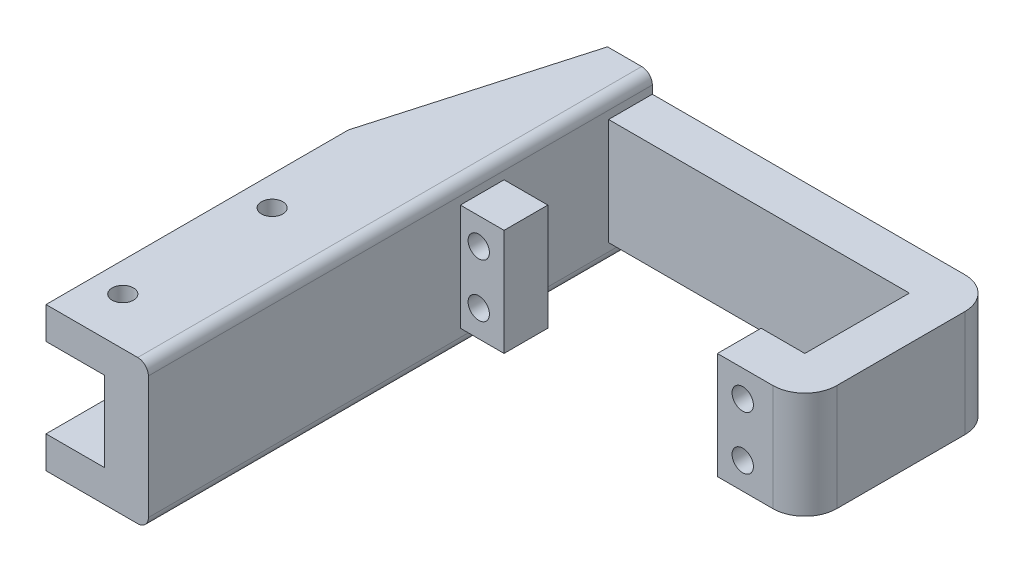
ISO-10303-21;
HEADER;
FILE_DESCRIPTION(('STEP AP214'),'2;1');
FILE_NAME('part.step','',(''),(''),'','','');
FILE_SCHEMA(('AUTOMOTIVE_DESIGN { 1 0 10303 214 1 1 1 1 }'));
ENDSEC;
DATA;
#1=APPLICATION_CONTEXT('core data for automotive mechanical design processes');
#2=APPLICATION_PROTOCOL_DEFINITION('international standard','automotive_design',2000,#1);
#3=PRODUCT_CONTEXT('',#1,'mechanical');
#4=PRODUCT('Part','Part','',(#3));
#5=PRODUCT_RELATED_PRODUCT_CATEGORY('part','',(#4));
#6=PRODUCT_DEFINITION_FORMATION('','',#4);
#7=PRODUCT_DEFINITION_CONTEXT('part definition',#1,'design');
#8=PRODUCT_DEFINITION('design','',#6,#7);
#9=PRODUCT_DEFINITION_SHAPE('','',#8);
#10=(LENGTH_UNIT() NAMED_UNIT(*) SI_UNIT(.MILLI.,.METRE.));
#11=(NAMED_UNIT(*) PLANE_ANGLE_UNIT() SI_UNIT($,.RADIAN.));
#12=(NAMED_UNIT(*) SI_UNIT($,.STERADIAN.) SOLID_ANGLE_UNIT());
#13=UNCERTAINTY_MEASURE_WITH_UNIT(LENGTH_MEASURE(1.E-05),#10,'distance_accuracy_value','');
#14=(GEOMETRIC_REPRESENTATION_CONTEXT(3) GLOBAL_UNCERTAINTY_ASSIGNED_CONTEXT((#13)) GLOBAL_UNIT_ASSIGNED_CONTEXT((#10,
#11,#12)) REPRESENTATION_CONTEXT('',''));
#15=CARTESIAN_POINT('',(0.,0.,0.));
#16=DIRECTION('',(0.,0.,1.));
#17=DIRECTION('',(1.,0.,0.));
#18=AXIS2_PLACEMENT_3D('',#15,#16,#17);
#19=CARTESIAN_POINT('',(-8.2,0.,0.));
#20=DIRECTION('',(1.,0.,0.));
#21=DIRECTION('',(0.,0.,-1.));
#22=AXIS2_PLACEMENT_3D('',#19,#20,#21);
#23=PLANE('',#22);
#24=DIRECTION('',(0.,1.,0.));
#25=VECTOR('',#24,1.);
#26=CARTESIAN_POINT('',(-8.2,23.5,47.8));
#27=LINE('',#26,#25);
#28=CARTESIAN_POINT('',(-8.2,2.5,47.8));
#29=VERTEX_POINT('',#28);
#30=CARTESIAN_POINT('',(-8.2,17.5,47.8));
#31=VERTEX_POINT('',#30);
#32=EDGE_CURVE('E221',#29,#31,#27,.T.);
#33=ORIENTED_EDGE('',*,*,#32,.F.);
#34=DIRECTION('',(0.,0.,1.));
#35=VECTOR('',#34,1.);
#36=CARTESIAN_POINT('',(-8.2,2.5,0.));
#37=LINE('',#36,#35);
#38=CARTESIAN_POINT('',(-8.2,2.5,94.5));
#39=VERTEX_POINT('',#38);
#40=EDGE_CURVE('E279',#29,#39,#37,.T.);
#41=ORIENTED_EDGE('',*,*,#40,.T.);
#42=DIRECTION('',(0.,-1.,0.));
#43=VECTOR('',#42,1.);
#44=CARTESIAN_POINT('',(-8.2,17.5,94.5));
#45=LINE('',#44,#43);
#46=CARTESIAN_POINT('',(-8.2,17.5,94.5));
#47=VERTEX_POINT('',#46);
#48=EDGE_CURVE('E257',#47,#39,#45,.T.);
#49=ORIENTED_EDGE('',*,*,#48,.F.);
#50=DIRECTION('',(0.,0.,1.));
#51=VECTOR('',#50,1.);
#52=CARTESIAN_POINT('',(-8.2,17.5,0.));
#53=LINE('',#52,#51);
#54=EDGE_CURVE('E209',#31,#47,#53,.T.);
#55=ORIENTED_EDGE('',*,*,#54,.F.);
#56=EDGE_LOOP('',(#33,#41,#49,#55));
#57=FACE_BOUND('',#56,.T.);
#58=ADVANCED_FACE('F32',(#57),#23,.F.);
#59=CARTESIAN_POINT('',(64.6,20.,8.2));
#60=DIRECTION('',(0.,-1.,0.));
#61=DIRECTION('',(1.,0.,0.));
#62=AXIS2_PLACEMENT_3D('',#59,#60,#61);
#63=PLANE('',#62);
#64=DIRECTION('',(0.,0.,-1.));
#65=VECTOR('',#64,1.);
#66=CARTESIAN_POINT('',(0.,20.,36.));
#67=LINE('',#66,#65);
#68=CARTESIAN_POINT('',(0.,20.,36.));
#69=VERTEX_POINT('',#68);
#70=CARTESIAN_POINT('',(0.,20.,27.8));
#71=VERTEX_POINT('',#70);
#72=EDGE_CURVE('E285',#69,#71,#67,.T.);
#73=ORIENTED_EDGE('',*,*,#72,.F.);
#74=DIRECTION('',(-1.,0.,0.));
#75=VECTOR('',#74,1.);
#76=CARTESIAN_POINT('',(8.2,20.,36.));
#77=LINE('',#76,#75);
#78=CARTESIAN_POINT('',(8.2,20.,36.));
#79=VERTEX_POINT('',#78);
#80=EDGE_CURVE('E370',#79,#69,#77,.T.);
#81=ORIENTED_EDGE('',*,*,#80,.F.);
#82=DIRECTION('',(0.,0.,-1.));
#83=VECTOR('',#82,1.);
#84=CARTESIAN_POINT('',(8.2,20.,36.));
#85=LINE('',#84,#83);
#86=CARTESIAN_POINT('',(8.2,20.,27.8));
#87=VERTEX_POINT('',#86);
#88=EDGE_CURVE('E377',#79,#87,#85,.T.);
#89=ORIENTED_EDGE('',*,*,#88,.T.);
#90=DIRECTION('',(-1.,0.,0.));
#91=VECTOR('',#90,1.);
#92=CARTESIAN_POINT('',(48.2,20.,27.8));
#93=LINE('',#92,#91);
#94=EDGE_CURVE('E326',#87,#71,#93,.T.);
#95=ORIENTED_EDGE('',*,*,#94,.T.);
#96=EDGE_LOOP('',(#73,#81,#89,#95));
#97=FACE_BOUND('',#96,.T.);
#98=ADVANCED_FACE('F464',(#97),#63,.F.);
#99=CARTESIAN_POINT('',(0.,20.,8.2));
#100=VERTEX_POINT('',#99);
#101=CARTESIAN_POINT('',(0.,20.,0.));
#102=VERTEX_POINT('',#101);
#103=EDGE_CURVE('E291',#100,#102,#67,.T.);
#104=ORIENTED_EDGE('',*,*,#103,.F.);
#105=DIRECTION('',(-1.,0.,0.));
#106=VECTOR('',#105,1.);
#107=CARTESIAN_POINT('',(64.6,20.,8.2));
#108=LINE('',#107,#106);
#109=CARTESIAN_POINT('',(56.4,20.,8.2));
#110=VERTEX_POINT('',#109);
#111=EDGE_CURVE('E386',#110,#100,#108,.T.);
#112=ORIENTED_EDGE('',*,*,#111,.F.);
#113=DIRECTION('',(0.,0.,-1.));
#114=VECTOR('',#113,1.);
#115=CARTESIAN_POINT('',(56.4,20.,36.));
#116=LINE('',#115,#114);
#117=CARTESIAN_POINT('',(56.4,20.,27.8));
#118=VERTEX_POINT('',#117);
#119=EDGE_CURVE('E368',#118,#110,#116,.T.);
#120=ORIENTED_EDGE('',*,*,#119,.F.);
#121=DIRECTION('',(1.,0.,0.));
#122=VECTOR('',#121,1.);
#123=CARTESIAN_POINT('',(48.2,20.,27.8));
#124=LINE('',#123,#122);
#125=CARTESIAN_POINT('',(48.2,20.,27.8));
#126=VERTEX_POINT('',#125);
#127=EDGE_CURVE('E355',#126,#118,#124,.T.);
#128=ORIENTED_EDGE('',*,*,#127,.F.);
#129=DIRECTION('',(0.,0.,-1.));
#130=VECTOR('',#129,1.);
#131=CARTESIAN_POINT('',(48.2,20.,36.));
#132=LINE('',#131,#130);
#133=CARTESIAN_POINT('',(48.2,20.,36.));
#134=VERTEX_POINT('',#133);
#135=EDGE_CURVE('E344',#134,#126,#132,.T.);
#136=ORIENTED_EDGE('',*,*,#135,.F.);
#137=DIRECTION('',(-1.,0.,0.));
#138=VECTOR('',#137,1.);
#139=CARTESIAN_POINT('',(56.4,20.,36.));
#140=LINE('',#139,#138);
#141=CARTESIAN_POINT('',(58.6,20.,36.));
#142=VERTEX_POINT('',#141);
#143=EDGE_CURVE('E358',#142,#134,#140,.T.);
#144=ORIENTED_EDGE('',*,*,#143,.F.);
#145=CARTESIAN_POINT('',(58.6,20.,30.));
#146=DIRECTION('',(0.,-1.,0.));
#147=DIRECTION('',(1.,0.,0.));
#148=AXIS2_PLACEMENT_3D('',#145,#146,#147);
#149=CIRCLE('',#148,6.);
#150=CARTESIAN_POINT('',(64.6,20.,30.));
#151=VERTEX_POINT('',#150);
#152=EDGE_CURVE('E404',#142,#151,#149,.F.);
#153=ORIENTED_EDGE('',*,*,#152,.T.);
#154=DIRECTION('',(0.,0.,-1.));
#155=VECTOR('',#154,1.);
#156=CARTESIAN_POINT('',(64.6,20.,8.2));
#157=LINE('',#156,#155);
#158=CARTESIAN_POINT('',(64.6,20.,6.));
#159=VERTEX_POINT('',#158);
#160=EDGE_CURVE('E390',#151,#159,#157,.T.);
#161=ORIENTED_EDGE('',*,*,#160,.T.);
#162=CARTESIAN_POINT('',(58.6,20.,6.));
#163=DIRECTION('',(0.,-1.,0.));
#164=DIRECTION('',(1.,0.,0.));
#165=AXIS2_PLACEMENT_3D('',#162,#163,#164);
#166=CIRCLE('',#165,6.);
#167=CARTESIAN_POINT('',(58.6,20.,0.));
#168=VERTEX_POINT('',#167);
#169=EDGE_CURVE('E406',#159,#168,#166,.F.);
#170=ORIENTED_EDGE('',*,*,#169,.T.);
#171=DIRECTION('',(-1.,0.,0.));
#172=VECTOR('',#171,1.);
#173=CARTESIAN_POINT('',(64.6,20.,0.));
#174=LINE('',#173,#172);
#175=EDGE_CURVE('E387',#168,#102,#174,.T.);
#176=ORIENTED_EDGE('',*,*,#175,.T.);
#177=EDGE_LOOP('',(#104,#112,#120,#128,#136,#144,#153,#161,#170,#176));
#178=FACE_BOUND('',#177,.T.);
#179=ADVANCED_FACE('F469',(#178),#63,.F.);
#180=CARTESIAN_POINT('',(0.,0.,8.2));
#181=DIRECTION('',(0.,1.,0.));
#182=DIRECTION('',(0.,0.,1.));
#183=AXIS2_PLACEMENT_3D('',#180,#181,#182);
#184=PLANE('',#183);
#185=DIRECTION('',(0.,0.,1.));
#186=VECTOR('',#185,1.);
#187=CARTESIAN_POINT('',(0.,0.,0.));
#188=LINE('',#187,#186);
#189=CARTESIAN_POINT('',(0.,0.,0.));
#190=VERTEX_POINT('',#189);
#191=CARTESIAN_POINT('',(0.,0.,8.2));
#192=VERTEX_POINT('',#191);
#193=EDGE_CURVE('E293',#190,#192,#188,.T.);
#194=ORIENTED_EDGE('',*,*,#193,.F.);
#195=DIRECTION('',(1.,0.,0.));
#196=VECTOR('',#195,1.);
#197=CARTESIAN_POINT('',(0.,0.,0.));
#198=LINE('',#197,#196);
#199=CARTESIAN_POINT('',(58.6,0.,0.));
#200=VERTEX_POINT('',#199);
#201=EDGE_CURVE('E383',#190,#200,#198,.T.);
#202=ORIENTED_EDGE('',*,*,#201,.T.);
#203=CARTESIAN_POINT('',(58.6,0.,6.));
#204=DIRECTION('',(0.,1.,0.));
#205=DIRECTION('',(0.,0.,1.));
#206=AXIS2_PLACEMENT_3D('',#203,#204,#205);
#207=CIRCLE('',#206,6.);
#208=CARTESIAN_POINT('',(64.6,0.,6.));
#209=VERTEX_POINT('',#208);
#210=EDGE_CURVE('E413',#200,#209,#207,.F.);
#211=ORIENTED_EDGE('',*,*,#210,.T.);
#212=DIRECTION('',(0.,0.,-1.));
#213=VECTOR('',#212,1.);
#214=CARTESIAN_POINT('',(64.6,0.,8.2));
#215=LINE('',#214,#213);
#216=CARTESIAN_POINT('',(64.6,0.,30.));
#217=VERTEX_POINT('',#216);
#218=EDGE_CURVE('E396',#217,#209,#215,.T.);
#219=ORIENTED_EDGE('',*,*,#218,.F.);
#220=CARTESIAN_POINT('',(58.6,0.,30.));
#221=DIRECTION('',(0.,1.,0.));
#222=DIRECTION('',(0.,0.,1.));
#223=AXIS2_PLACEMENT_3D('',#220,#221,#222);
#224=CIRCLE('',#223,6.);
#225=CARTESIAN_POINT('',(58.6,0.,36.));
#226=VERTEX_POINT('',#225);
#227=EDGE_CURVE('E411',#217,#226,#224,.F.);
#228=ORIENTED_EDGE('',*,*,#227,.T.);
#229=DIRECTION('',(1.,0.,0.));
#230=VECTOR('',#229,1.);
#231=CARTESIAN_POINT('',(64.6,0.,36.));
#232=LINE('',#231,#230);
#233=CARTESIAN_POINT('',(48.2,0.,36.));
#234=VERTEX_POINT('',#233);
#235=EDGE_CURVE('E360',#234,#226,#232,.T.);
#236=ORIENTED_EDGE('',*,*,#235,.F.);
#237=DIRECTION('',(0.,0.,1.));
#238=VECTOR('',#237,1.);
#239=CARTESIAN_POINT('',(48.2,0.,27.8));
#240=LINE('',#239,#238);
#241=CARTESIAN_POINT('',(48.2,0.,27.8));
#242=VERTEX_POINT('',#241);
#243=EDGE_CURVE('E348',#242,#234,#240,.T.);
#244=ORIENTED_EDGE('',*,*,#243,.F.);
#245=DIRECTION('',(1.,0.,0.));
#246=VECTOR('',#245,1.);
#247=CARTESIAN_POINT('',(48.2,0.,27.8));
#248=LINE('',#247,#246);
#249=CARTESIAN_POINT('',(56.4,0.,27.8));
#250=VERTEX_POINT('',#249);
#251=EDGE_CURVE('E351',#242,#250,#248,.T.);
#252=ORIENTED_EDGE('',*,*,#251,.T.);
#253=DIRECTION('',(0.,0.,-1.));
#254=VECTOR('',#253,1.);
#255=CARTESIAN_POINT('',(56.4,0.,36.));
#256=LINE('',#255,#254);
#257=CARTESIAN_POINT('',(56.4,0.,8.2));
#258=VERTEX_POINT('',#257);
#259=EDGE_CURVE('E363',#250,#258,#256,.T.);
#260=ORIENTED_EDGE('',*,*,#259,.T.);
#261=DIRECTION('',(1.,0.,0.));
#262=VECTOR('',#261,1.);
#263=CARTESIAN_POINT('',(0.,0.,8.2));
#264=LINE('',#263,#262);
#265=EDGE_CURVE('E384',#192,#258,#264,.T.);
#266=ORIENTED_EDGE('',*,*,#265,.F.);
#267=EDGE_LOOP('',(#194,#202,#211,#219,#228,#236,#244,#252,#260,#266));
#268=FACE_BOUND('',#267,.T.);
#269=ADVANCED_FACE('F511',(#268),#184,.F.);
#270=CARTESIAN_POINT('',(0.,0.,27.8));
#271=VERTEX_POINT('',#270);
#272=CARTESIAN_POINT('',(0.,0.,36.));
#273=VERTEX_POINT('',#272);
#274=EDGE_CURVE('E299',#271,#273,#188,.T.);
#275=ORIENTED_EDGE('',*,*,#274,.F.);
#276=DIRECTION('',(-1.,0.,0.));
#277=VECTOR('',#276,1.);
#278=CARTESIAN_POINT('',(48.2,0.,27.8));
#279=LINE('',#278,#277);
#280=CARTESIAN_POINT('',(8.2,0.,27.8));
#281=VERTEX_POINT('',#280);
#282=EDGE_CURVE('E325',#281,#271,#279,.T.);
#283=ORIENTED_EDGE('',*,*,#282,.F.);
#284=DIRECTION('',(0.,0.,-1.));
#285=VECTOR('',#284,1.);
#286=CARTESIAN_POINT('',(8.2,0.,36.));
#287=LINE('',#286,#285);
#288=CARTESIAN_POINT('',(8.2,0.,36.));
#289=VERTEX_POINT('',#288);
#290=EDGE_CURVE('E380',#289,#281,#287,.T.);
#291=ORIENTED_EDGE('',*,*,#290,.F.);
#292=DIRECTION('',(1.,0.,0.));
#293=VECTOR('',#292,1.);
#294=CARTESIAN_POINT('',(0.,0.,36.));
#295=LINE('',#294,#293);
#296=EDGE_CURVE('E373',#273,#289,#295,.T.);
#297=ORIENTED_EDGE('',*,*,#296,.F.);
#298=EDGE_LOOP('',(#275,#283,#291,#297));
#299=FACE_BOUND('',#298,.T.);
#300=ADVANCED_FACE('F493',(#299),#184,.F.);
#301=CARTESIAN_POINT('',(56.4,0.,36.));
#302=DIRECTION('',(1.,0.,0.));
#303=DIRECTION('',(0.,0.,-1.));
#304=AXIS2_PLACEMENT_3D('',#301,#302,#303);
#305=PLANE('',#304);
#306=DIRECTION('',(0.,-1.,0.));
#307=VECTOR('',#306,1.);
#308=CARTESIAN_POINT('',(56.4,20.,27.8));
#309=LINE('',#308,#307);
#310=EDGE_CURVE('E340',#118,#250,#309,.T.);
#311=ORIENTED_EDGE('',*,*,#310,.F.);
#312=ORIENTED_EDGE('',*,*,#119,.T.);
#313=DIRECTION('',(0.,-1.,0.));
#314=VECTOR('',#313,1.);
#315=CARTESIAN_POINT('',(56.4,0.,8.2));
#316=LINE('',#315,#314);
#317=EDGE_CURVE('E357',#110,#258,#316,.T.);
#318=ORIENTED_EDGE('',*,*,#317,.T.);
#319=ORIENTED_EDGE('',*,*,#259,.F.);
#320=EDGE_LOOP('',(#311,#312,#318,#319));
#321=FACE_BOUND('',#320,.T.);
#322=ADVANCED_FACE('F489',(#321),#305,.F.);
#323=CARTESIAN_POINT('',(0.,0.,8.2));
#324=DIRECTION('',(0.,0.,1.));
#325=DIRECTION('',(1.,0.,0.));
#326=AXIS2_PLACEMENT_3D('',#323,#324,#325);
#327=PLANE('',#326);
#328=ORIENTED_EDGE('',*,*,#111,.T.);
#329=DIRECTION('',(0.,-1.,0.));
#330=VECTOR('',#329,1.);
#331=CARTESIAN_POINT('',(0.,20.,8.2));
#332=LINE('',#331,#330);
#333=EDGE_CURVE('E332',#100,#192,#332,.T.);
#334=ORIENTED_EDGE('',*,*,#333,.T.);
#335=ORIENTED_EDGE('',*,*,#265,.T.);
#336=ORIENTED_EDGE('',*,*,#317,.F.);
#337=EDGE_LOOP('',(#328,#334,#335,#336));
#338=FACE_BOUND('',#337,.T.);
#339=ADVANCED_FACE('F492',(#338),#327,.T.);
#340=CARTESIAN_POINT('',(64.6,0.,8.2));
#341=DIRECTION('',(-1.,0.,0.));
#342=DIRECTION('',(0.,0.,1.));
#343=AXIS2_PLACEMENT_3D('',#340,#341,#342);
#344=PLANE('',#343);
#345=ORIENTED_EDGE('',*,*,#218,.T.);
#346=DIRECTION('',(0.,1.,0.));
#347=VECTOR('',#346,1.);
#348=CARTESIAN_POINT('',(64.6,0.,6.));
#349=LINE('',#348,#347);
#350=EDGE_CURVE('E401',#209,#159,#349,.T.);
#351=ORIENTED_EDGE('',*,*,#350,.T.);
#352=ORIENTED_EDGE('',*,*,#160,.F.);
#353=DIRECTION('',(0.,1.,0.));
#354=VECTOR('',#353,1.);
#355=CARTESIAN_POINT('',(64.6,0.,30.));
#356=LINE('',#355,#354);
#357=EDGE_CURVE('E399',#151,#217,#356,.F.);
#358=ORIENTED_EDGE('',*,*,#357,.T.);
#359=EDGE_LOOP('',(#345,#351,#352,#358));
#360=FACE_BOUND('',#359,.T.);
#361=ADVANCED_FACE('F504',(#360),#344,.F.);
#362=CARTESIAN_POINT('',(0.,0.,0.));
#363=DIRECTION('',(0.,0.,1.));
#364=DIRECTION('',(1.,0.,0.));
#365=AXIS2_PLACEMENT_3D('',#362,#363,#364);
#366=PLANE('',#365);
#367=DIRECTION('',(1.,0.,0.));
#368=VECTOR('',#367,1.);
#369=CARTESIAN_POINT('',(-8.2,-3.5,0.));
#370=LINE('',#369,#368);
#371=CARTESIAN_POINT('',(-8.4,-3.5,0.));
#372=VERTEX_POINT('',#371);
#373=CARTESIAN_POINT('',(-2.,-3.5,0.));
#374=VERTEX_POINT('',#373);
#375=EDGE_CURVE('E294',#372,#374,#370,.T.);
#376=ORIENTED_EDGE('',*,*,#375,.F.);
#377=DIRECTION('',(0.,-1.,0.));
#378=VECTOR('',#377,1.);
#379=CARTESIAN_POINT('',(-8.4,0.,0.));
#380=LINE('',#379,#378);
#381=CARTESIAN_POINT('',(-8.4,23.5,0.));
#382=VERTEX_POINT('',#381);
#383=EDGE_CURVE('E41',#372,#382,#380,.F.);
#384=ORIENTED_EDGE('',*,*,#383,.T.);
#385=DIRECTION('',(-1.,0.,0.));
#386=VECTOR('',#385,1.);
#387=CARTESIAN_POINT('',(0.,23.5,0.));
#388=LINE('',#387,#386);
#389=CARTESIAN_POINT('',(-2.,23.5,0.));
#390=VERTEX_POINT('',#389);
#391=EDGE_CURVE('E46',#390,#382,#388,.T.);
#392=ORIENTED_EDGE('',*,*,#391,.F.);
#393=CARTESIAN_POINT('',(-2.,21.5,0.));
#394=DIRECTION('',(0.,0.,1.));
#395=DIRECTION('',(1.,0.,0.));
#396=AXIS2_PLACEMENT_3D('',#393,#394,#395);
#397=CIRCLE('',#396,2.);
#398=CARTESIAN_POINT('',(0.,21.5,0.));
#399=VERTEX_POINT('',#398);
#400=EDGE_CURVE('E424',#390,#399,#397,.F.);
#401=ORIENTED_EDGE('',*,*,#400,.T.);
#402=DIRECTION('',(0.,-1.,0.));
#403=VECTOR('',#402,1.);
#404=CARTESIAN_POINT('',(0.,23.5,0.));
#405=LINE('',#404,#403);
#406=EDGE_CURVE('E288',#399,#102,#405,.T.);
#407=ORIENTED_EDGE('',*,*,#406,.T.);
#408=ORIENTED_EDGE('',*,*,#175,.F.);
#409=DIRECTION('',(0.,1.,0.));
#410=VECTOR('',#409,1.);
#411=CARTESIAN_POINT('',(58.6,0.,0.));
#412=LINE('',#411,#410);
#413=EDGE_CURVE('E408',#168,#200,#412,.F.);
#414=ORIENTED_EDGE('',*,*,#413,.T.);
#415=ORIENTED_EDGE('',*,*,#201,.F.);
#416=DIRECTION('',(0.,1.,0.));
#417=VECTOR('',#416,1.);
#418=CARTESIAN_POINT('',(0.,-3.5,0.));
#419=LINE('',#418,#417);
#420=CARTESIAN_POINT('',(0.,-1.5,0.));
#421=VERTEX_POINT('',#420);
#422=EDGE_CURVE('E296',#421,#190,#419,.T.);
#423=ORIENTED_EDGE('',*,*,#422,.F.);
#424=CARTESIAN_POINT('',(-2.,-1.5,0.));
#425=DIRECTION('',(0.,0.,1.));
#426=DIRECTION('',(1.,0.,0.));
#427=AXIS2_PLACEMENT_3D('',#424,#425,#426);
#428=CIRCLE('',#427,2.);
#429=EDGE_CURVE('E426',#421,#374,#428,.F.);
#430=ORIENTED_EDGE('',*,*,#429,.T.);
#431=EDGE_LOOP('',(#376,#384,#392,#401,#407,#408,#414,#415,#423,#430));
#432=FACE_BOUND('',#431,.T.);
#433=ADVANCED_FACE('F435',(#432),#366,.F.);
#434=CARTESIAN_POINT('',(8.2,0.,36.));
#435=DIRECTION('',(-1.,0.,0.));
#436=DIRECTION('',(0.,0.,1.));
#437=AXIS2_PLACEMENT_3D('',#434,#435,#436);
#438=PLANE('',#437);
#439=ORIENTED_EDGE('',*,*,#290,.T.);
#440=DIRECTION('',(0.,1.,0.));
#441=VECTOR('',#440,1.);
#442=CARTESIAN_POINT('',(8.2,0.,27.8));
#443=LINE('',#442,#441);
#444=EDGE_CURVE('E335',#281,#87,#443,.T.);
#445=ORIENTED_EDGE('',*,*,#444,.T.);
#446=ORIENTED_EDGE('',*,*,#88,.F.);
#447=DIRECTION('',(0.,1.,0.));
#448=VECTOR('',#447,1.);
#449=CARTESIAN_POINT('',(8.2,0.,36.));
#450=LINE('',#449,#448);
#451=EDGE_CURVE('E375',#289,#79,#450,.T.);
#452=ORIENTED_EDGE('',*,*,#451,.F.);
#453=EDGE_LOOP('',(#439,#445,#446,#452));
#454=FACE_BOUND('',#453,.T.);
#455=ADVANCED_FACE('F497',(#454),#438,.F.);
#456=CARTESIAN_POINT('',(0.,0.,36.));
#457=DIRECTION('',(0.,0.,1.));
#458=DIRECTION('',(1.,0.,0.));
#459=AXIS2_PLACEMENT_3D('',#456,#457,#458);
#460=PLANE('',#459);
#461=DIRECTION('',(0.,1.,0.));
#462=VECTOR('',#461,1.);
#463=CARTESIAN_POINT('',(0.,21.5,36.));
#464=LINE('',#463,#462);
#465=EDGE_CURVE('E275',#273,#69,#464,.T.);
#466=ORIENTED_EDGE('',*,*,#465,.F.);
#467=ORIENTED_EDGE('',*,*,#296,.T.);
#468=ORIENTED_EDGE('',*,*,#451,.T.);
#469=ORIENTED_EDGE('',*,*,#80,.T.);
#470=EDGE_LOOP('',(#466,#467,#468,#469));
#471=FACE_BOUND('',#470,.T.);
#472=CARTESIAN_POINT('',(3.44999999999998,5.,36.));
#473=DIRECTION('',(0.,0.,1.));
#474=DIRECTION('',(1.,0.,0.));
#475=AXIS2_PLACEMENT_3D('',#472,#473,#474);
#476=CIRCLE('',#475,1.99999999999999);
#477=CARTESIAN_POINT('',(5.44999999999997,5.,36.));
#478=VERTEX_POINT('',#477);
#479=EDGE_CURVE('E307',#478,#478,#476,.T.);
#480=ORIENTED_EDGE('',*,*,#479,.F.);
#481=EDGE_LOOP('',(#480));
#482=FACE_BOUND('',#481,.T.);
#483=CARTESIAN_POINT('',(3.45,15.,36.));
#484=DIRECTION('',(0.,0.,1.));
#485=DIRECTION('',(1.,0.,0.));
#486=AXIS2_PLACEMENT_3D('',#483,#484,#485);
#487=CIRCLE('',#486,1.99999999999999);
#488=CARTESIAN_POINT('',(5.44999999999998,15.,36.));
#489=VERTEX_POINT('',#488);
#490=EDGE_CURVE('E313',#489,#489,#487,.T.);
#491=ORIENTED_EDGE('',*,*,#490,.F.);
#492=EDGE_LOOP('',(#491));
#493=FACE_BOUND('',#492,.T.);
#494=ADVANCED_FACE('F487',(#471,#482,#493),#460,.T.);
#495=CARTESIAN_POINT('',(0.,0.,36.));
#496=DIRECTION('',(0.,0.,-1.));
#497=DIRECTION('',(-1.,0.,0.));
#498=AXIS2_PLACEMENT_3D('',#495,#496,#497);
#499=PLANE('',#498);
#500=CARTESIAN_POINT('',(52.95,5.,36.));
#501=DIRECTION('',(0.,0.,1.));
#502=DIRECTION('',(1.,0.,0.));
#503=AXIS2_PLACEMENT_3D('',#500,#501,#502);
#504=CIRCLE('',#503,1.99999999999999);
#505=CARTESIAN_POINT('',(54.95,5.,36.));
#506=VERTEX_POINT('',#505);
#507=EDGE_CURVE('E301',#506,#506,#504,.T.);
#508=ORIENTED_EDGE('',*,*,#507,.F.);
#509=EDGE_LOOP('',(#508));
#510=FACE_BOUND('',#509,.T.);
#511=CARTESIAN_POINT('',(52.95,15.,36.));
#512=DIRECTION('',(0.,0.,1.));
#513=DIRECTION('',(1.,0.,0.));
#514=AXIS2_PLACEMENT_3D('',#511,#512,#513);
#515=CIRCLE('',#514,1.99999999999999);
#516=CARTESIAN_POINT('',(54.95,15.,36.));
#517=VERTEX_POINT('',#516);
#518=EDGE_CURVE('E319',#517,#517,#515,.T.);
#519=ORIENTED_EDGE('',*,*,#518,.F.);
#520=EDGE_LOOP('',(#519));
#521=FACE_BOUND('',#520,.T.);
#522=ORIENTED_EDGE('',*,*,#235,.T.);
#523=DIRECTION('',(0.,1.,0.));
#524=VECTOR('',#523,1.);
#525=CARTESIAN_POINT('',(58.6,0.,36.));
#526=LINE('',#525,#524);
#527=EDGE_CURVE('E415',#226,#142,#526,.T.);
#528=ORIENTED_EDGE('',*,*,#527,.T.);
#529=ORIENTED_EDGE('',*,*,#143,.T.);
#530=DIRECTION('',(0.,1.,0.));
#531=VECTOR('',#530,1.);
#532=CARTESIAN_POINT('',(48.2,0.,36.));
#533=LINE('',#532,#531);
#534=EDGE_CURVE('E341',#234,#134,#533,.T.);
#535=ORIENTED_EDGE('',*,*,#534,.F.);
#536=EDGE_LOOP('',(#522,#528,#529,#535));
#537=FACE_BOUND('',#536,.T.);
#538=ADVANCED_FACE('F483',(#510,#521,#537),#499,.F.);
#539=CARTESIAN_POINT('',(48.2,20.,27.8));
#540=DIRECTION('',(0.,0.,1.));
#541=DIRECTION('',(0.,-1.,0.));
#542=AXIS2_PLACEMENT_3D('',#539,#540,#541);
#543=PLANE('',#542);
#544=CARTESIAN_POINT('',(52.95,5.,27.8));
#545=DIRECTION('',(0.,0.,1.));
#546=DIRECTION('',(0.,-1.,0.));
#547=AXIS2_PLACEMENT_3D('',#544,#545,#546);
#548=CIRCLE('',#547,1.99999999999999);
#549=CARTESIAN_POINT('',(52.95,3.,27.8));
#550=VERTEX_POINT('',#549);
#551=EDGE_CURVE('E304',#550,#550,#548,.T.);
#552=ORIENTED_EDGE('',*,*,#551,.T.);
#553=EDGE_LOOP('',(#552));
#554=FACE_BOUND('',#553,.T.);
#555=CARTESIAN_POINT('',(52.95,15.,27.8));
#556=DIRECTION('',(0.,0.,1.));
#557=DIRECTION('',(0.,-1.,0.));
#558=AXIS2_PLACEMENT_3D('',#555,#556,#557);
#559=CIRCLE('',#558,1.99999999999999);
#560=CARTESIAN_POINT('',(52.95,13.,27.8));
#561=VERTEX_POINT('',#560);
#562=EDGE_CURVE('E322',#561,#561,#559,.T.);
#563=ORIENTED_EDGE('',*,*,#562,.T.);
#564=EDGE_LOOP('',(#563));
#565=FACE_BOUND('',#564,.T.);
#566=ORIENTED_EDGE('',*,*,#310,.T.);
#567=ORIENTED_EDGE('',*,*,#251,.F.);
#568=DIRECTION('',(0.,-1.,0.));
#569=VECTOR('',#568,1.);
#570=CARTESIAN_POINT('',(48.2,20.,27.8));
#571=LINE('',#570,#569);
#572=EDGE_CURVE('E346',#126,#242,#571,.T.);
#573=ORIENTED_EDGE('',*,*,#572,.F.);
#574=ORIENTED_EDGE('',*,*,#127,.T.);
#575=EDGE_LOOP('',(#566,#567,#573,#574));
#576=FACE_BOUND('',#575,.T.);
#577=ADVANCED_FACE('F479',(#554,#565,#576),#543,.F.);
#578=CARTESIAN_POINT('',(48.2,0.,0.));
#579=DIRECTION('',(-1.,0.,0.));
#580=DIRECTION('',(0.,0.,1.));
#581=AXIS2_PLACEMENT_3D('',#578,#579,#580);
#582=PLANE('',#581);
#583=ORIENTED_EDGE('',*,*,#534,.T.);
#584=ORIENTED_EDGE('',*,*,#135,.T.);
#585=ORIENTED_EDGE('',*,*,#572,.T.);
#586=ORIENTED_EDGE('',*,*,#243,.T.);
#587=EDGE_LOOP('',(#583,#584,#585,#586));
#588=FACE_BOUND('',#587,.T.);
#589=ADVANCED_FACE('F476',(#588),#582,.T.);
#590=CARTESIAN_POINT('',(48.2,20.,27.8));
#591=DIRECTION('',(0.,0.,1.));
#592=DIRECTION('',(1.,0.,0.));
#593=AXIS2_PLACEMENT_3D('',#590,#591,#592);
#594=PLANE('',#593);
#595=CARTESIAN_POINT('',(3.44999999999998,5.,27.8));
#596=DIRECTION('',(0.,0.,1.));
#597=DIRECTION('',(1.,0.,0.));
#598=AXIS2_PLACEMENT_3D('',#595,#596,#597);
#599=CIRCLE('',#598,1.99999999999999);
#600=CARTESIAN_POINT('',(5.44999999999998,5.,27.8));
#601=VERTEX_POINT('',#600);
#602=EDGE_CURVE('E310',#601,#601,#599,.T.);
#603=ORIENTED_EDGE('',*,*,#602,.T.);
#604=EDGE_LOOP('',(#603));
#605=FACE_BOUND('',#604,.T.);
#606=CARTESIAN_POINT('',(3.45,15.,27.8));
#607=DIRECTION('',(0.,0.,1.));
#608=DIRECTION('',(1.,0.,0.));
#609=AXIS2_PLACEMENT_3D('',#606,#607,#608);
#610=CIRCLE('',#609,1.99999999999999);
#611=CARTESIAN_POINT('',(5.44999999999999,15.,27.8));
#612=VERTEX_POINT('',#611);
#613=EDGE_CURVE('E316',#612,#612,#610,.T.);
#614=ORIENTED_EDGE('',*,*,#613,.T.);
#615=EDGE_LOOP('',(#614));
#616=FACE_BOUND('',#615,.T.);
#617=ORIENTED_EDGE('',*,*,#282,.T.);
#618=DIRECTION('',(0.,-1.,0.));
#619=VECTOR('',#618,1.);
#620=CARTESIAN_POINT('',(0.,20.,27.8));
#621=LINE('',#620,#619);
#622=EDGE_CURVE('E329',#71,#271,#621,.T.);
#623=ORIENTED_EDGE('',*,*,#622,.F.);
#624=ORIENTED_EDGE('',*,*,#94,.F.);
#625=ORIENTED_EDGE('',*,*,#444,.F.);
#626=EDGE_LOOP('',(#617,#623,#624,#625));
#627=FACE_BOUND('',#626,.T.);
#628=ADVANCED_FACE('F474',(#605,#616,#627),#594,.F.);
#629=CARTESIAN_POINT('',(0.,20.,27.8));
#630=DIRECTION('',(-1.,0.,0.));
#631=DIRECTION('',(0.,0.,1.));
#632=AXIS2_PLACEMENT_3D('',#629,#630,#631);
#633=PLANE('',#632);
#634=ORIENTED_EDGE('',*,*,#274,.T.);
#635=ORIENTED_EDGE('',*,*,#465,.T.);
#636=ORIENTED_EDGE('',*,*,#72,.T.);
#637=ORIENTED_EDGE('',*,*,#622,.T.);
#638=EDGE_LOOP('',(#634,#635,#636,#637));
#639=FACE_BOUND('',#638,.T.);
#640=DIRECTION('',(0.,1.,0.));
#641=VECTOR('',#640,1.);
#642=CARTESIAN_POINT('',(0.,21.5,94.5));
#643=LINE('',#642,#641);
#644=CARTESIAN_POINT('',(0.,-1.49999999999998,94.5));
#645=VERTEX_POINT('',#644);
#646=CARTESIAN_POINT('',(0.,21.5,94.5));
#647=VERTEX_POINT('',#646);
#648=EDGE_CURVE('E272',#645,#647,#643,.T.);
#649=ORIENTED_EDGE('',*,*,#648,.F.);
#650=DIRECTION('',(0.,0.,1.));
#651=VECTOR('',#650,1.);
#652=CARTESIAN_POINT('',(0.,-1.5,0.));
#653=LINE('',#652,#651);
#654=EDGE_CURVE('E422',#645,#421,#653,.F.);
#655=ORIENTED_EDGE('',*,*,#654,.T.);
#656=ORIENTED_EDGE('',*,*,#422,.T.);
#657=ORIENTED_EDGE('',*,*,#193,.T.);
#658=ORIENTED_EDGE('',*,*,#333,.F.);
#659=ORIENTED_EDGE('',*,*,#103,.T.);
#660=ORIENTED_EDGE('',*,*,#406,.F.);
#661=DIRECTION('',(0.,0.,-1.));
#662=VECTOR('',#661,1.);
#663=CARTESIAN_POINT('',(0.,21.5,36.));
#664=LINE('',#663,#662);
#665=EDGE_CURVE('E420',#399,#647,#664,.F.);
#666=ORIENTED_EDGE('',*,*,#665,.T.);
#667=EDGE_LOOP('',(#649,#655,#656,#657,#658,#659,#660,#666));
#668=FACE_BOUND('',#667,.T.);
#669=ADVANCED_FACE('F539',(#639,#668),#633,.F.);
#670=CARTESIAN_POINT('',(52.95,15.,36.));
#671=DIRECTION('',(0.,0.,1.));
#672=DIRECTION('',(1.,0.,0.));
#673=AXIS2_PLACEMENT_3D('',#670,#671,#672);
#674=CYLINDRICAL_SURFACE('',#673,1.99999999999999);
#675=ORIENTED_EDGE('',*,*,#562,.F.);
#676=EDGE_LOOP('',(#675));
#677=FACE_BOUND('',#676,.T.);
#678=ORIENTED_EDGE('',*,*,#518,.T.);
#679=EDGE_LOOP('',(#678));
#680=FACE_BOUND('',#679,.T.);
#681=ADVANCED_FACE('F588',(#677,#680),#674,.F.);
#682=CARTESIAN_POINT('',(3.45,15.,36.));
#683=DIRECTION('',(0.,0.,1.));
#684=DIRECTION('',(1.,0.,0.));
#685=AXIS2_PLACEMENT_3D('',#682,#683,#684);
#686=CYLINDRICAL_SURFACE('',#685,1.99999999999999);
#687=ORIENTED_EDGE('',*,*,#613,.F.);
#688=EDGE_LOOP('',(#687));
#689=FACE_BOUND('',#688,.T.);
#690=ORIENTED_EDGE('',*,*,#490,.T.);
#691=EDGE_LOOP('',(#690));
#692=FACE_BOUND('',#691,.T.);
#693=ADVANCED_FACE('F585',(#689,#692),#686,.F.);
#694=CARTESIAN_POINT('',(3.44999999999998,5.,36.));
#695=DIRECTION('',(0.,0.,1.));
#696=DIRECTION('',(1.,0.,0.));
#697=AXIS2_PLACEMENT_3D('',#694,#695,#696);
#698=CYLINDRICAL_SURFACE('',#697,1.99999999999999);
#699=ORIENTED_EDGE('',*,*,#602,.F.);
#700=EDGE_LOOP('',(#699));
#701=FACE_BOUND('',#700,.T.);
#702=ORIENTED_EDGE('',*,*,#479,.T.);
#703=EDGE_LOOP('',(#702));
#704=FACE_BOUND('',#703,.T.);
#705=ADVANCED_FACE('F587',(#701,#704),#698,.F.);
#706=CARTESIAN_POINT('',(52.95,5.,36.));
#707=DIRECTION('',(0.,0.,1.));
#708=DIRECTION('',(1.,0.,0.));
#709=AXIS2_PLACEMENT_3D('',#706,#707,#708);
#710=CYLINDRICAL_SURFACE('',#709,1.99999999999999);
#711=ORIENTED_EDGE('',*,*,#551,.F.);
#712=EDGE_LOOP('',(#711));
#713=FACE_BOUND('',#712,.T.);
#714=ORIENTED_EDGE('',*,*,#507,.T.);
#715=EDGE_LOOP('',(#714));
#716=FACE_BOUND('',#715,.T.);
#717=ADVANCED_FACE('F519',(#713,#716),#710,.F.);
#718=CARTESIAN_POINT('',(58.6,0.,6.));
#719=DIRECTION('',(0.,1.,0.));
#720=DIRECTION('',(0.,0.,1.));
#721=AXIS2_PLACEMENT_3D('',#718,#719,#720);
#722=CYLINDRICAL_SURFACE('',#721,6.);
#723=ORIENTED_EDGE('',*,*,#210,.F.);
#724=ORIENTED_EDGE('',*,*,#413,.F.);
#725=ORIENTED_EDGE('',*,*,#169,.F.);
#726=ORIENTED_EDGE('',*,*,#350,.F.);
#727=EDGE_LOOP('',(#723,#724,#725,#726));
#728=FACE_BOUND('',#727,.T.);
#729=ADVANCED_FACE('F515',(#728),#722,.T.);
#730=CARTESIAN_POINT('',(58.6,0.,30.));
#731=DIRECTION('',(0.,1.,0.));
#732=DIRECTION('',(0.,0.,1.));
#733=AXIS2_PLACEMENT_3D('',#730,#731,#732);
#734=CYLINDRICAL_SURFACE('',#733,6.);
#735=ORIENTED_EDGE('',*,*,#227,.F.);
#736=ORIENTED_EDGE('',*,*,#357,.F.);
#737=ORIENTED_EDGE('',*,*,#152,.F.);
#738=ORIENTED_EDGE('',*,*,#527,.F.);
#739=EDGE_LOOP('',(#735,#736,#737,#738));
#740=FACE_BOUND('',#739,.T.);
#741=ADVANCED_FACE('F518',(#740),#734,.T.);
#742=CARTESIAN_POINT('',(0.,-3.5,0.));
#743=DIRECTION('',(0.,-1.,0.));
#744=DIRECTION('',(0.,0.,-1.));
#745=AXIS2_PLACEMENT_3D('',#742,#743,#744);
#746=PLANE('',#745);
#747=DIRECTION('',(0.,0.,-1.));
#748=VECTOR('',#747,1.);
#749=CARTESIAN_POINT('',(-19.2,-3.5,36.));
#750=LINE('',#749,#748);
#751=CARTESIAN_POINT('',(-19.2,-3.5,94.5));
#752=VERTEX_POINT('',#751);
#753=CARTESIAN_POINT('',(-19.2,-3.5,37.8));
#754=VERTEX_POINT('',#753);
#755=EDGE_CURVE('E283',#752,#754,#750,.T.);
#756=ORIENTED_EDGE('',*,*,#755,.T.);
#757=DIRECTION('',(-0.274721127897378,0.,0.961523947640823));
#758=VECTOR('',#757,1.);
#759=CARTESIAN_POINT('',(-19.2,-3.5,37.8));
#760=LINE('',#759,#758);
#761=EDGE_CURVE('E213',#754,#372,#760,.F.);
#762=ORIENTED_EDGE('',*,*,#761,.T.);
#763=ORIENTED_EDGE('',*,*,#375,.T.);
#764=DIRECTION('',(0.,0.,1.));
#765=VECTOR('',#764,1.);
#766=CARTESIAN_POINT('',(-2.,-3.5,36.));
#767=LINE('',#766,#765);
#768=CARTESIAN_POINT('',(-2.,-3.5,94.5));
#769=VERTEX_POINT('',#768);
#770=EDGE_CURVE('E418',#374,#769,#767,.T.);
#771=ORIENTED_EDGE('',*,*,#770,.T.);
#772=DIRECTION('',(1.,0.,0.));
#773=VECTOR('',#772,1.);
#774=CARTESIAN_POINT('',(-19.2,-3.5,94.5));
#775=LINE('',#774,#773);
#776=EDGE_CURVE('E266',#752,#769,#775,.T.);
#777=ORIENTED_EDGE('',*,*,#776,.F.);
#778=EDGE_LOOP('',(#756,#762,#763,#771,#777));
#779=FACE_BOUND('',#778,.T.);
#780=CARTESIAN_POINT('',(-13.7,-3.5,85.6));
#781=DIRECTION('',(0.,-1.,0.));
#782=DIRECTION('',(0.,0.,-1.));
#783=AXIS2_PLACEMENT_3D('',#780,#781,#782);
#784=CIRCLE('',#783,2.);
#785=CARTESIAN_POINT('',(-13.7,-3.5,83.6));
#786=VERTEX_POINT('',#785);
#787=EDGE_CURVE('E228',#786,#786,#784,.T.);
#788=ORIENTED_EDGE('',*,*,#787,.F.);
#789=EDGE_LOOP('',(#788));
#790=FACE_BOUND('',#789,.T.);
#791=CARTESIAN_POINT('',(-13.7,-3.5,57.6));
#792=DIRECTION('',(0.,-1.,0.));
#793=DIRECTION('',(0.,0.,-1.));
#794=AXIS2_PLACEMENT_3D('',#791,#792,#793);
#795=CIRCLE('',#794,2.);
#796=CARTESIAN_POINT('',(-13.7,-3.5,55.6));
#797=VERTEX_POINT('',#796);
#798=EDGE_CURVE('E238',#797,#797,#795,.T.);
#799=ORIENTED_EDGE('',*,*,#798,.F.);
#800=EDGE_LOOP('',(#799));
#801=FACE_BOUND('',#800,.T.);
#802=ADVANCED_FACE('F440',(#779,#790,#801),#746,.T.);
#803=CARTESIAN_POINT('',(0.,23.5,0.));
#804=DIRECTION('',(0.,1.,0.));
#805=DIRECTION('',(0.,0.,1.));
#806=AXIS2_PLACEMENT_3D('',#803,#804,#805);
#807=PLANE('',#806);
#808=ORIENTED_EDGE('',*,*,#391,.T.);
#809=DIRECTION('',(0.274721127897378,0.,-0.961523947640823));
#810=VECTOR('',#809,1.);
#811=CARTESIAN_POINT('',(-19.2,23.5,37.8));
#812=LINE('',#811,#810);
#813=CARTESIAN_POINT('',(-19.2,23.5,37.8));
#814=VERTEX_POINT('',#813);
#815=EDGE_CURVE('E11',#382,#814,#812,.F.);
#816=ORIENTED_EDGE('',*,*,#815,.T.);
#817=DIRECTION('',(0.,0.,-1.));
#818=VECTOR('',#817,1.);
#819=CARTESIAN_POINT('',(-19.2,23.5,36.));
#820=LINE('',#819,#818);
#821=CARTESIAN_POINT('',(-19.2,23.5,94.5));
#822=VERTEX_POINT('',#821);
#823=EDGE_CURVE('E197',#822,#814,#820,.T.);
#824=ORIENTED_EDGE('',*,*,#823,.F.);
#825=DIRECTION('',(-1.,0.,0.));
#826=VECTOR('',#825,1.);
#827=CARTESIAN_POINT('',(-2.,23.5,94.5));
#828=LINE('',#827,#826);
#829=CARTESIAN_POINT('',(-2.,23.5,94.5));
#830=VERTEX_POINT('',#829);
#831=EDGE_CURVE('E251',#830,#822,#828,.T.);
#832=ORIENTED_EDGE('',*,*,#831,.F.);
#833=DIRECTION('',(0.,0.,-1.));
#834=VECTOR('',#833,1.);
#835=CARTESIAN_POINT('',(-2.,23.5,0.));
#836=LINE('',#835,#834);
#837=EDGE_CURVE('E277',#830,#390,#836,.T.);
#838=ORIENTED_EDGE('',*,*,#837,.T.);
#839=EDGE_LOOP('',(#808,#816,#824,#832,#838));
#840=FACE_BOUND('',#839,.T.);
#841=CARTESIAN_POINT('',(-13.7,23.5,85.6));
#842=DIRECTION('',(0.,-1.,0.));
#843=DIRECTION('',(0.,0.,-1.));
#844=AXIS2_PLACEMENT_3D('',#841,#842,#843);
#845=CIRCLE('',#844,1.99999999999999);
#846=CARTESIAN_POINT('',(-13.7,23.5,83.6));
#847=VERTEX_POINT('',#846);
#848=EDGE_CURVE('E231',#847,#847,#845,.T.);
#849=ORIENTED_EDGE('',*,*,#848,.T.);
#850=EDGE_LOOP('',(#849));
#851=FACE_BOUND('',#850,.T.);
#852=CARTESIAN_POINT('',(-13.7,23.5,57.6));
#853=DIRECTION('',(0.,-1.,0.));
#854=DIRECTION('',(0.,0.,-1.));
#855=AXIS2_PLACEMENT_3D('',#852,#853,#854);
#856=CIRCLE('',#855,1.99999999999999);
#857=CARTESIAN_POINT('',(-13.7,23.5,55.6));
#858=VERTEX_POINT('',#857);
#859=EDGE_CURVE('E241',#858,#858,#856,.T.);
#860=ORIENTED_EDGE('',*,*,#859,.T.);
#861=EDGE_LOOP('',(#860));
#862=FACE_BOUND('',#861,.T.);
#863=ADVANCED_FACE('F194',(#840,#851,#862),#807,.T.);
#864=CARTESIAN_POINT('',(-19.2,2.5,0.));
#865=DIRECTION('',(0.,1.,0.));
#866=DIRECTION('',(0.,0.,1.));
#867=AXIS2_PLACEMENT_3D('',#864,#865,#866);
#868=PLANE('',#867);
#869=DIRECTION('',(1.,0.,0.));
#870=VECTOR('',#869,1.);
#871=CARTESIAN_POINT('',(-19.2,2.5,47.8));
#872=LINE('',#871,#870);
#873=CARTESIAN_POINT('',(-19.2,2.5,47.8));
#874=VERTEX_POINT('',#873);
#875=EDGE_CURVE('E218',#874,#29,#872,.T.);
#876=ORIENTED_EDGE('',*,*,#875,.F.);
#877=DIRECTION('',(0.,0.,1.));
#878=VECTOR('',#877,1.);
#879=CARTESIAN_POINT('',(-19.2,2.5,0.));
#880=LINE('',#879,#878);
#881=CARTESIAN_POINT('',(-19.2,2.5,94.5));
#882=VERTEX_POINT('',#881);
#883=EDGE_CURVE('E281',#874,#882,#880,.T.);
#884=ORIENTED_EDGE('',*,*,#883,.T.);
#885=DIRECTION('',(-1.,0.,0.));
#886=VECTOR('',#885,1.);
#887=CARTESIAN_POINT('',(-8.2,2.5,94.5));
#888=LINE('',#887,#886);
#889=EDGE_CURVE('E260',#39,#882,#888,.T.);
#890=ORIENTED_EDGE('',*,*,#889,.F.);
#891=ORIENTED_EDGE('',*,*,#40,.F.);
#892=EDGE_LOOP('',(#876,#884,#890,#891));
#893=FACE_BOUND('',#892,.T.);
#894=CARTESIAN_POINT('',(-13.7,2.5,85.6));
#895=DIRECTION('',(0.,1.,0.));
#896=DIRECTION('',(0.,0.,1.));
#897=AXIS2_PLACEMENT_3D('',#894,#895,#896);
#898=CIRCLE('',#897,1.99999999999999);
#899=CARTESIAN_POINT('',(-13.7,2.5,87.6));
#900=VERTEX_POINT('',#899);
#901=EDGE_CURVE('E235',#900,#900,#898,.T.);
#902=ORIENTED_EDGE('',*,*,#901,.F.);
#903=EDGE_LOOP('',(#902));
#904=FACE_BOUND('',#903,.T.);
#905=CARTESIAN_POINT('',(-13.7,2.5,57.6));
#906=DIRECTION('',(0.,1.,0.));
#907=DIRECTION('',(0.,0.,1.));
#908=AXIS2_PLACEMENT_3D('',#905,#906,#907);
#909=CIRCLE('',#908,1.99999999999999);
#910=CARTESIAN_POINT('',(-13.7,2.5,59.6));
#911=VERTEX_POINT('',#910);
#912=EDGE_CURVE('E245',#911,#911,#909,.T.);
#913=ORIENTED_EDGE('',*,*,#912,.F.);
#914=EDGE_LOOP('',(#913));
#915=FACE_BOUND('',#914,.T.);
#916=ADVANCED_FACE('F452',(#893,#904,#915),#868,.T.);
#917=CARTESIAN_POINT('',(-19.2,0.,0.));
#918=DIRECTION('',(1.,0.,0.));
#919=DIRECTION('',(0.,0.,-1.));
#920=AXIS2_PLACEMENT_3D('',#917,#918,#919);
#921=PLANE('',#920);
#922=ORIENTED_EDGE('',*,*,#883,.F.);
#923=DIRECTION('',(0.,-1.,0.));
#924=VECTOR('',#923,1.);
#925=CARTESIAN_POINT('',(-19.2,23.5,47.8));
#926=LINE('',#925,#924);
#927=CARTESIAN_POINT('',(-19.2,17.5,47.8));
#928=VERTEX_POINT('',#927);
#929=EDGE_CURVE('E216',#928,#874,#926,.T.);
#930=ORIENTED_EDGE('',*,*,#929,.F.);
#931=DIRECTION('',(0.,0.,1.));
#932=VECTOR('',#931,1.);
#933=CARTESIAN_POINT('',(-19.2,17.5,0.));
#934=LINE('',#933,#932);
#935=CARTESIAN_POINT('',(-19.2,17.5,94.5));
#936=VERTEX_POINT('',#935);
#937=EDGE_CURVE('E210',#928,#936,#934,.T.);
#938=ORIENTED_EDGE('',*,*,#937,.T.);
#939=DIRECTION('',(0.,-1.,0.));
#940=VECTOR('',#939,1.);
#941=CARTESIAN_POINT('',(-19.2,23.5,94.5));
#942=LINE('',#941,#940);
#943=EDGE_CURVE('E208',#822,#936,#942,.T.);
#944=ORIENTED_EDGE('',*,*,#943,.F.);
#945=ORIENTED_EDGE('',*,*,#823,.T.);
#946=DIRECTION('',(0.,1.,0.));
#947=VECTOR('',#946,1.);
#948=CARTESIAN_POINT('',(-19.2,-3.5,37.8));
#949=LINE('',#948,#947);
#950=EDGE_CURVE('E206',#754,#814,#949,.T.);
#951=ORIENTED_EDGE('',*,*,#950,.F.);
#952=ORIENTED_EDGE('',*,*,#755,.F.);
#953=DIRECTION('',(0.,-1.,0.));
#954=VECTOR('',#953,1.);
#955=CARTESIAN_POINT('',(-19.2,2.5,94.5));
#956=LINE('',#955,#954);
#957=EDGE_CURVE('E263',#882,#752,#956,.T.);
#958=ORIENTED_EDGE('',*,*,#957,.F.);
#959=EDGE_LOOP('',(#922,#930,#938,#944,#945,#951,#952,#958));
#960=FACE_BOUND('',#959,.T.);
#961=ADVANCED_FACE('F205',(#960),#921,.F.);
#962=CARTESIAN_POINT('',(-19.2,17.5,0.));
#963=DIRECTION('',(0.,1.,0.));
#964=DIRECTION('',(0.,0.,1.));
#965=AXIS2_PLACEMENT_3D('',#962,#963,#964);
#966=PLANE('',#965);
#967=CARTESIAN_POINT('',(-13.7,17.5,85.6));
#968=DIRECTION('',(0.,1.,0.));
#969=DIRECTION('',(0.,0.,1.));
#970=AXIS2_PLACEMENT_3D('',#967,#968,#969);
#971=CIRCLE('',#970,1.99999999999999);
#972=CARTESIAN_POINT('',(-13.7,17.5,87.6));
#973=VERTEX_POINT('',#972);
#974=EDGE_CURVE('E234',#973,#973,#971,.T.);
#975=ORIENTED_EDGE('',*,*,#974,.T.);
#976=EDGE_LOOP('',(#975));
#977=FACE_BOUND('',#976,.T.);
#978=CARTESIAN_POINT('',(-13.7,17.5,57.6));
#979=DIRECTION('',(0.,1.,0.));
#980=DIRECTION('',(0.,0.,1.));
#981=AXIS2_PLACEMENT_3D('',#978,#979,#980);
#982=CIRCLE('',#981,1.99999999999999);
#983=CARTESIAN_POINT('',(-13.7,17.5,59.6));
#984=VERTEX_POINT('',#983);
#985=EDGE_CURVE('E244',#984,#984,#982,.T.);
#986=ORIENTED_EDGE('',*,*,#985,.T.);
#987=EDGE_LOOP('',(#986));
#988=FACE_BOUND('',#987,.T.);
#989=ORIENTED_EDGE('',*,*,#937,.F.);
#990=DIRECTION('',(1.,0.,0.));
#991=VECTOR('',#990,1.);
#992=CARTESIAN_POINT('',(-19.2,17.5,47.8));
#993=LINE('',#992,#991);
#994=EDGE_CURVE('E215',#928,#31,#993,.T.);
#995=ORIENTED_EDGE('',*,*,#994,.T.);
#996=ORIENTED_EDGE('',*,*,#54,.T.);
#997=DIRECTION('',(1.,0.,0.));
#998=VECTOR('',#997,1.);
#999=CARTESIAN_POINT('',(-19.2,17.5,94.5));
#1000=LINE('',#999,#998);
#1001=EDGE_CURVE('E254',#936,#47,#1000,.T.);
#1002=ORIENTED_EDGE('',*,*,#1001,.F.);
#1003=EDGE_LOOP('',(#989,#995,#996,#1002));
#1004=FACE_BOUND('',#1003,.T.);
#1005=ADVANCED_FACE('F460',(#977,#988,#1004),#966,.F.);
#1006=CARTESIAN_POINT('',(-2.,-1.5,0.));
#1007=DIRECTION('',(0.,0.,-1.));
#1008=DIRECTION('',(-1.,0.,0.));
#1009=AXIS2_PLACEMENT_3D('',#1006,#1007,#1008);
#1010=CYLINDRICAL_SURFACE('',#1009,2.);
#1011=ORIENTED_EDGE('',*,*,#429,.F.);
#1012=ORIENTED_EDGE('',*,*,#654,.F.);
#1013=CARTESIAN_POINT('',(-2.00000000000002,-1.49999999999998,94.5));
#1014=DIRECTION('',(0.,0.,1.));
#1015=DIRECTION('',(1.,0.,0.));
#1016=AXIS2_PLACEMENT_3D('',#1013,#1014,#1015);
#1017=CIRCLE('',#1016,2.00000000000002);
#1018=EDGE_CURVE('E269',#769,#645,#1017,.T.);
#1019=ORIENTED_EDGE('',*,*,#1018,.F.);
#1020=ORIENTED_EDGE('',*,*,#770,.F.);
#1021=EDGE_LOOP('',(#1011,#1012,#1019,#1020));
#1022=FACE_BOUND('',#1021,.T.);
#1023=ADVANCED_FACE('F524',(#1022),#1010,.T.);
#1024=CARTESIAN_POINT('',(-2.,21.5,0.));
#1025=DIRECTION('',(0.,0.,1.));
#1026=DIRECTION('',(1.,0.,0.));
#1027=AXIS2_PLACEMENT_3D('',#1024,#1025,#1026);
#1028=CYLINDRICAL_SURFACE('',#1027,2.);
#1029=ORIENTED_EDGE('',*,*,#837,.F.);
#1030=CARTESIAN_POINT('',(-2.00000000000003,21.5,94.5));
#1031=DIRECTION('',(0.,0.,1.));
#1032=DIRECTION('',(-1.,0.,0.));
#1033=AXIS2_PLACEMENT_3D('',#1030,#1031,#1032);
#1034=CIRCLE('',#1033,2.00000000000003);
#1035=EDGE_CURVE('E248',#647,#830,#1034,.T.);
#1036=ORIENTED_EDGE('',*,*,#1035,.F.);
#1037=ORIENTED_EDGE('',*,*,#665,.F.);
#1038=ORIENTED_EDGE('',*,*,#400,.F.);
#1039=EDGE_LOOP('',(#1029,#1036,#1037,#1038));
#1040=FACE_BOUND('',#1039,.T.);
#1041=ADVANCED_FACE('F526',(#1040),#1028,.T.);
#1042=CARTESIAN_POINT('',(-2.00000000000003,21.5,94.5));
#1043=DIRECTION('',(0.,0.,-1.));
#1044=DIRECTION('',(-1.,0.,0.));
#1045=AXIS2_PLACEMENT_3D('',#1042,#1043,#1044);
#1046=PLANE('',#1045);
#1047=ORIENTED_EDGE('',*,*,#1035,.T.);
#1048=ORIENTED_EDGE('',*,*,#831,.T.);
#1049=ORIENTED_EDGE('',*,*,#943,.T.);
#1050=ORIENTED_EDGE('',*,*,#1001,.T.);
#1051=ORIENTED_EDGE('',*,*,#48,.T.);
#1052=ORIENTED_EDGE('',*,*,#889,.T.);
#1053=ORIENTED_EDGE('',*,*,#957,.T.);
#1054=ORIENTED_EDGE('',*,*,#776,.T.);
#1055=ORIENTED_EDGE('',*,*,#1018,.T.);
#1056=ORIENTED_EDGE('',*,*,#648,.T.);
#1057=EDGE_LOOP('',(#1047,#1048,#1049,#1050,#1051,#1052,#1053,#1054,#1055,#1056));
#1058=FACE_BOUND('',#1057,.T.);
#1059=ADVANCED_FACE('F445',(#1058),#1046,.F.);
#1060=CARTESIAN_POINT('',(-13.7,-3.5,57.6));
#1061=DIRECTION('',(0.,-1.,0.));
#1062=DIRECTION('',(0.,0.,-1.));
#1063=AXIS2_PLACEMENT_3D('',#1060,#1061,#1062);
#1064=CYLINDRICAL_SURFACE('',#1063,1.99999999999999);
#1065=ORIENTED_EDGE('',*,*,#859,.F.);
#1066=EDGE_LOOP('',(#1065));
#1067=FACE_BOUND('',#1066,.T.);
#1068=ORIENTED_EDGE('',*,*,#985,.F.);
#1069=EDGE_LOOP('',(#1068));
#1070=FACE_BOUND('',#1069,.T.);
#1071=ADVANCED_FACE('F533',(#1067,#1070),#1064,.F.);
#1072=ORIENTED_EDGE('',*,*,#912,.T.);
#1073=EDGE_LOOP('',(#1072));
#1074=FACE_BOUND('',#1073,.T.);
#1075=ORIENTED_EDGE('',*,*,#798,.T.);
#1076=EDGE_LOOP('',(#1075));
#1077=FACE_BOUND('',#1076,.T.);
#1078=ADVANCED_FACE('F781',(#1074,#1077),#1064,.F.);
#1079=CARTESIAN_POINT('',(-13.7,-3.5,85.6));
#1080=DIRECTION('',(0.,-1.,0.));
#1081=DIRECTION('',(0.,0.,-1.));
#1082=AXIS2_PLACEMENT_3D('',#1079,#1080,#1081);
#1083=CYLINDRICAL_SURFACE('',#1082,1.99999999999999);
#1084=ORIENTED_EDGE('',*,*,#848,.F.);
#1085=EDGE_LOOP('',(#1084));
#1086=FACE_BOUND('',#1085,.T.);
#1087=ORIENTED_EDGE('',*,*,#974,.F.);
#1088=EDGE_LOOP('',(#1087));
#1089=FACE_BOUND('',#1088,.T.);
#1090=ADVANCED_FACE('F790',(#1086,#1089),#1083,.F.);
#1091=ORIENTED_EDGE('',*,*,#901,.T.);
#1092=EDGE_LOOP('',(#1091));
#1093=FACE_BOUND('',#1092,.T.);
#1094=ORIENTED_EDGE('',*,*,#787,.T.);
#1095=EDGE_LOOP('',(#1094));
#1096=FACE_BOUND('',#1095,.T.);
#1097=ADVANCED_FACE('F798',(#1093,#1096),#1083,.F.);
#1098=CARTESIAN_POINT('',(-47.9923600977759,23.5,47.8));
#1099=DIRECTION('',(0.,0.,-1.));
#1100=DIRECTION('',(-1.,0.,0.));
#1101=AXIS2_PLACEMENT_3D('',#1098,#1099,#1100);
#1102=PLANE('',#1101);
#1103=ORIENTED_EDGE('',*,*,#875,.T.);
#1104=ORIENTED_EDGE('',*,*,#32,.T.);
#1105=ORIENTED_EDGE('',*,*,#994,.F.);
#1106=ORIENTED_EDGE('',*,*,#929,.T.);
#1107=EDGE_LOOP('',(#1103,#1104,#1105,#1106));
#1108=FACE_BOUND('',#1107,.T.);
#1109=ADVANCED_FACE('F457',(#1108),#1102,.F.);
#1110=CARTESIAN_POINT('',(-19.2,-3.5,37.8));
#1111=DIRECTION('',(-0.961523947640823,0.,-0.274721127897378));
#1112=DIRECTION('',(0.,1.,0.));
#1113=AXIS2_PLACEMENT_3D('',#1110,#1111,#1112);
#1114=PLANE('',#1113);
#1115=ORIENTED_EDGE('',*,*,#815,.F.);
#1116=ORIENTED_EDGE('',*,*,#383,.F.);
#1117=ORIENTED_EDGE('',*,*,#761,.F.);
#1118=ORIENTED_EDGE('',*,*,#950,.T.);
#1119=EDGE_LOOP('',(#1115,#1116,#1117,#1118));
#1120=FACE_BOUND('',#1119,.T.);
#1121=ADVANCED_FACE('F34',(#1120),#1114,.T.);
#1122=CLOSED_SHELL('',(#58,#98,#179,#269,#300,#322,#339,#361,#433,#455,#494,#538,#577,#589,#628,
#669,#681,#693,#705,#717,#729,#741,#802,#863,#916,#961,#1005,#1023,#1041,#1059,#1071,#1078,
#1090,#1097,#1109,#1121));
#1123=MANIFOLD_SOLID_BREP('B2',#1122);
#1124=ADVANCED_BREP_SHAPE_REPRESENTATION('',(#18,#1123),#14);
#1125=SHAPE_DEFINITION_REPRESENTATION(#9,#1124);
ENDSEC;
END-ISO-10303-21;
